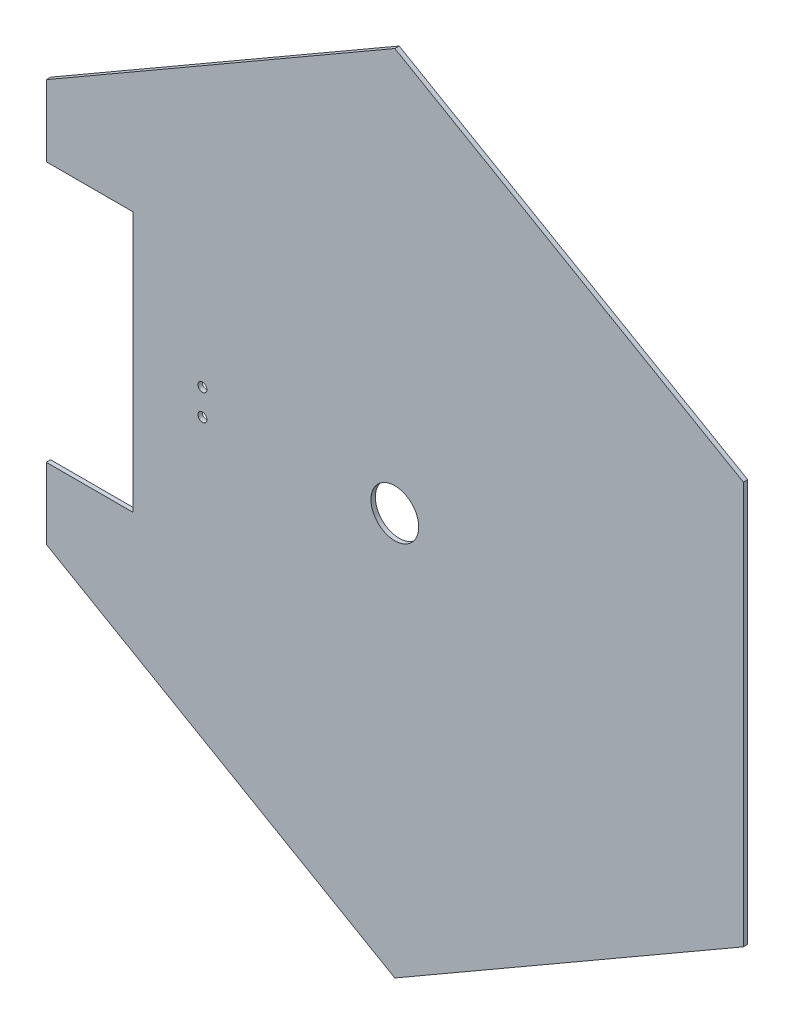
ISO-10303-21;
HEADER;
FILE_DESCRIPTION(('STEP AP214'),'2;1');
FILE_NAME('part.step','',(''),(''),'','','');
FILE_SCHEMA(('AUTOMOTIVE_DESIGN { 1 0 10303 214 1 1 1 1 }'));
ENDSEC;
DATA;
#1=APPLICATION_CONTEXT('core data for automotive mechanical design processes');
#2=APPLICATION_PROTOCOL_DEFINITION('international standard','automotive_design',2000,#1);
#3=PRODUCT_CONTEXT('',#1,'mechanical');
#4=PRODUCT('Part','Part','',(#3));
#5=PRODUCT_RELATED_PRODUCT_CATEGORY('part','',(#4));
#6=PRODUCT_DEFINITION_FORMATION('','',#4);
#7=PRODUCT_DEFINITION_CONTEXT('part definition',#1,'design');
#8=PRODUCT_DEFINITION('design','',#6,#7);
#9=PRODUCT_DEFINITION_SHAPE('','',#8);
#10=(LENGTH_UNIT() NAMED_UNIT(*) SI_UNIT(.MILLI.,.METRE.));
#11=(NAMED_UNIT(*) PLANE_ANGLE_UNIT() SI_UNIT($,.RADIAN.));
#12=(NAMED_UNIT(*) SI_UNIT($,.STERADIAN.) SOLID_ANGLE_UNIT());
#13=UNCERTAINTY_MEASURE_WITH_UNIT(LENGTH_MEASURE(1.E-05),#10,'distance_accuracy_value','');
#14=(GEOMETRIC_REPRESENTATION_CONTEXT(3) GLOBAL_UNCERTAINTY_ASSIGNED_CONTEXT((#13)) GLOBAL_UNIT_ASSIGNED_CONTEXT((#10,
#11,#12)) REPRESENTATION_CONTEXT('',''));
#15=CARTESIAN_POINT('',(0.,0.,0.));
#16=DIRECTION('',(0.,0.,1.));
#17=DIRECTION('',(1.,0.,0.));
#18=AXIS2_PLACEMENT_3D('',#15,#16,#17);
#19=CARTESIAN_POINT('',(0.,0.,1831.975));
#20=DIRECTION('',(0.,0.,-1.));
#21=DIRECTION('',(-1.,0.,0.));
#22=AXIS2_PLACEMENT_3D('',#19,#20,#21);
#23=PLANE('',#22);
#24=CARTESIAN_POINT('',(0.,0.,1831.97499999977));
#25=DIRECTION('',(0.,0.,-1.));
#26=DIRECTION('',(-1.,0.,0.));
#27=AXIS2_PLACEMENT_3D('',#24,#25,#26);
#28=CIRCLE('',#27,17.4625);
#29=CARTESIAN_POINT('',(-17.4625,0.,1831.97499999977));
#30=VERTEX_POINT('',#29);
#31=EDGE_CURVE('E124',#30,#30,#28,.T.);
#32=ORIENTED_EDGE('',*,*,#31,.T.);
#33=EDGE_LOOP('',(#32));
#34=FACE_BOUND('',#33,.T.);
#35=CARTESIAN_POINT('',(-140.865724971035,-9.525,1831.975));
#36=DIRECTION('',(0.,0.,-1.));
#37=DIRECTION('',(-1.,0.,0.));
#38=AXIS2_PLACEMENT_3D('',#35,#36,#37);
#39=CIRCLE('',#38,3.2639);
#40=CARTESIAN_POINT('',(-144.129624971035,-9.525,1831.975));
#41=VERTEX_POINT('',#40);
#42=EDGE_CURVE('E127',#41,#41,#39,.T.);
#43=ORIENTED_EDGE('',*,*,#42,.T.);
#44=EDGE_LOOP('',(#43));
#45=FACE_BOUND('',#44,.T.);
#46=CARTESIAN_POINT('',(-140.865724971035,9.525,1831.975));
#47=DIRECTION('',(0.,0.,-1.));
#48=DIRECTION('',(-1.,0.,0.));
#49=AXIS2_PLACEMENT_3D('',#46,#47,#48);
#50=CIRCLE('',#49,3.2639);
#51=CARTESIAN_POINT('',(-144.129624971035,9.525,1831.975));
#52=VERTEX_POINT('',#51);
#53=EDGE_CURVE('E20',#52,#52,#50,.T.);
#54=ORIENTED_EDGE('',*,*,#53,.T.);
#55=EDGE_LOOP('',(#54));
#56=FACE_BOUND('',#55,.T.);
#57=DIRECTION('',(-0.866025403784429,0.500000000000017,0.));
#58=VECTOR('',#57,1.);
#59=CARTESIAN_POINT('',(-123.398182996562,-223.396025829432,1831.975));
#60=LINE('',#59,#58);
#61=CARTESIAN_POINT('',(-255.16572497106,-147.319999999999,1831.975));
#62=VERTEX_POINT('',#61);
#63=CARTESIAN_POINT('',(-1.62444224738319E-12,-294.640000000004,1831.975));
#64=VERTEX_POINT('',#63);
#65=EDGE_CURVE('E143',#62,#64,#60,.F.);
#66=ORIENTED_EDGE('',*,*,#65,.T.);
#67=DIRECTION('',(-0.866025403784429,-0.500000000000017,0.));
#68=VECTOR('',#67,1.);
#69=CARTESIAN_POINT('',(131.767541974473,-218.563974170593,1831.975));
#70=LINE('',#69,#68);
#71=CARTESIAN_POINT('',(255.16572497106,-147.32,1831.975));
#72=VERTEX_POINT('',#71);
#73=EDGE_CURVE('E147',#64,#72,#70,.F.);
#74=ORIENTED_EDGE('',*,*,#73,.T.);
#75=DIRECTION('',(0.,1.,0.));
#76=VECTOR('',#75,1.);
#77=CARTESIAN_POINT('',(255.16572497106,4.83205165884408,1831.975));
#78=LINE('',#77,#76);
#79=CARTESIAN_POINT('',(255.165724971058,147.319999999997,1831.975));
#80=VERTEX_POINT('',#79);
#81=EDGE_CURVE('E151',#72,#80,#78,.T.);
#82=ORIENTED_EDGE('',*,*,#81,.T.);
#83=DIRECTION('',(0.866025403784429,-0.500000000000017,0.));
#84=VECTOR('',#83,1.);
#85=CARTESIAN_POINT('',(123.398182996587,223.396025829407,1831.975));
#86=LINE('',#85,#84);
#87=CARTESIAN_POINT('',(-8.84859697202219E-13,294.640000000002,1831.975));
#88=VERTEX_POINT('',#87);
#89=EDGE_CURVE('E155',#80,#88,#86,.F.);
#90=ORIENTED_EDGE('',*,*,#89,.T.);
#91=DIRECTION('',(0.866025403784429,0.500000000000017,0.));
#92=VECTOR('',#91,1.);
#93=CARTESIAN_POINT('',(-131.767541974473,218.563974170593,1831.975));
#94=LINE('',#93,#92);
#95=CARTESIAN_POINT('',(-255.16572497106,147.32,1831.975));
#96=VERTEX_POINT('',#95);
#97=EDGE_CURVE('E159',#88,#96,#94,.F.);
#98=ORIENTED_EDGE('',*,*,#97,.T.);
#99=DIRECTION('',(0.,1.,0.));
#100=VECTOR('',#99,1.);
#101=CARTESIAN_POINT('',(-255.16572497106,-4.832051658839,1831.975));
#102=LINE('',#101,#100);
#103=CARTESIAN_POINT('',(-255.16572497106,95.25,1831.975));
#104=VERTEX_POINT('',#103);
#105=EDGE_CURVE('E163',#96,#104,#102,.F.);
#106=ORIENTED_EDGE('',*,*,#105,.T.);
#107=DIRECTION('',(1.,0.,0.));
#108=VECTOR('',#107,1.);
#109=CARTESIAN_POINT('',(-224.260467708114,95.25,1831.975));
#110=LINE('',#109,#108);
#111=CARTESIAN_POINT('',(-191.665724971035,95.25,1831.975));
#112=VERTEX_POINT('',#111);
#113=EDGE_CURVE('E107',#112,#104,#110,.F.);
#114=ORIENTED_EDGE('',*,*,#113,.F.);
#115=DIRECTION('',(0.,1.,0.));
#116=VECTOR('',#115,1.);
#117=CARTESIAN_POINT('',(-191.665724971035,-33.7703803986266,1831.975));
#118=LINE('',#117,#116);
#119=CARTESIAN_POINT('',(-191.665724971035,-95.25,1831.975));
#120=VERTEX_POINT('',#119);
#121=EDGE_CURVE('E92',#120,#112,#118,.T.);
#122=ORIENTED_EDGE('',*,*,#121,.F.);
#123=DIRECTION('',(1.,0.,0.));
#124=VECTOR('',#123,1.);
#125=CARTESIAN_POINT('',(-224.260467708114,-95.25,1831.975));
#126=LINE('',#125,#124);
#127=CARTESIAN_POINT('',(-255.16572497106,-95.25,1831.975));
#128=VERTEX_POINT('',#127);
#129=EDGE_CURVE('E97',#120,#128,#126,.F.);
#130=ORIENTED_EDGE('',*,*,#129,.T.);
#131=DIRECTION('',(0.,1.,0.));
#132=VECTOR('',#131,1.);
#133=CARTESIAN_POINT('',(-255.16572497106,-4.832051658839,1831.975));
#134=LINE('',#133,#132);
#135=EDGE_CURVE('E134',#128,#62,#134,.F.);
#136=ORIENTED_EDGE('',*,*,#135,.T.);
#137=EDGE_LOOP('',(#66,#74,#82,#90,#98,#106,#114,#122,#130,#136));
#138=FACE_BOUND('',#137,.T.);
#139=ADVANCED_FACE('F17',(#34,#45,#56,#138),#23,.F.);
#140=CARTESIAN_POINT('',(-224.260467708114,-95.25,-500000.000000032));
#141=DIRECTION('',(0.,-1.,0.));
#142=DIRECTION('',(0.,0.,-1.));
#143=AXIS2_PLACEMENT_3D('',#140,#141,#142);
#144=PLANE('',#143);
#145=DIRECTION('',(0.,0.,1.));
#146=VECTOR('',#145,1.);
#147=CARTESIAN_POINT('',(-191.665724971035,-95.25,-500000.000000032));
#148=LINE('',#147,#146);
#149=CARTESIAN_POINT('',(-191.665724971035,-95.25,1828.8));
#150=VERTEX_POINT('',#149);
#151=EDGE_CURVE('E99',#150,#120,#148,.T.);
#152=ORIENTED_EDGE('',*,*,#151,.F.);
#153=DIRECTION('',(-1.,0.,0.));
#154=VECTOR('',#153,1.);
#155=CARTESIAN_POINT('',(0.,-95.25,1828.8));
#156=LINE('',#155,#154);
#157=CARTESIAN_POINT('',(-255.16572497106,-95.25,1828.8));
#158=VERTEX_POINT('',#157);
#159=EDGE_CURVE('E126',#158,#150,#156,.F.);
#160=ORIENTED_EDGE('',*,*,#159,.F.);
#161=DIRECTION('',(0.,0.,-1.));
#162=VECTOR('',#161,1.);
#163=CARTESIAN_POINT('',(-255.16572497106,-95.25,1831.975));
#164=LINE('',#163,#162);
#165=EDGE_CURVE('E102',#158,#128,#164,.F.);
#166=ORIENTED_EDGE('',*,*,#165,.T.);
#167=ORIENTED_EDGE('',*,*,#129,.F.);
#168=EDGE_LOOP('',(#152,#160,#166,#167));
#169=FACE_BOUND('',#168,.T.);
#170=ADVANCED_FACE('F98',(#169),#144,.F.);
#171=CARTESIAN_POINT('',(-191.665724971035,-33.7703803986266,-500000.000000032));
#172=DIRECTION('',(-1.,0.,0.));
#173=DIRECTION('',(0.,0.,1.));
#174=AXIS2_PLACEMENT_3D('',#171,#172,#173);
#175=PLANE('',#174);
#176=DIRECTION('',(0.,0.,-1.));
#177=VECTOR('',#176,1.);
#178=CARTESIAN_POINT('',(-191.665724971035,95.25,-500000.000000032));
#179=LINE('',#178,#177);
#180=CARTESIAN_POINT('',(-191.665724971035,95.25,1828.8));
#181=VERTEX_POINT('',#180);
#182=EDGE_CURVE('E109',#181,#112,#179,.F.);
#183=ORIENTED_EDGE('',*,*,#182,.F.);
#184=DIRECTION('',(0.,1.,0.));
#185=VECTOR('',#184,1.);
#186=CARTESIAN_POINT('',(-191.665724971035,0.,1828.8));
#187=LINE('',#186,#185);
#188=EDGE_CURVE('E113',#150,#181,#187,.T.);
#189=ORIENTED_EDGE('',*,*,#188,.F.);
#190=ORIENTED_EDGE('',*,*,#151,.T.);
#191=ORIENTED_EDGE('',*,*,#121,.T.);
#192=EDGE_LOOP('',(#183,#189,#190,#191));
#193=FACE_BOUND('',#192,.T.);
#194=ADVANCED_FACE('F111',(#193),#175,.T.);
#195=CARTESIAN_POINT('',(-224.260467708114,95.25,-500000.000000032));
#196=DIRECTION('',(0.,-1.,0.));
#197=DIRECTION('',(0.,0.,-1.));
#198=AXIS2_PLACEMENT_3D('',#195,#196,#197);
#199=PLANE('',#198);
#200=DIRECTION('',(0.,0.,-1.));
#201=VECTOR('',#200,1.);
#202=CARTESIAN_POINT('',(-255.16572497106,95.25,1831.975));
#203=LINE('',#202,#201);
#204=CARTESIAN_POINT('',(-255.16572497106,95.25,1828.8));
#205=VERTEX_POINT('',#204);
#206=EDGE_CURVE('E161',#104,#205,#203,.T.);
#207=ORIENTED_EDGE('',*,*,#206,.T.);
#208=DIRECTION('',(-1.,0.,0.));
#209=VECTOR('',#208,1.);
#210=CARTESIAN_POINT('',(0.,95.25,1828.8));
#211=LINE('',#210,#209);
#212=EDGE_CURVE('E170',#181,#205,#211,.T.);
#213=ORIENTED_EDGE('',*,*,#212,.F.);
#214=ORIENTED_EDGE('',*,*,#182,.T.);
#215=ORIENTED_EDGE('',*,*,#113,.T.);
#216=EDGE_LOOP('',(#207,#213,#214,#215));
#217=FACE_BOUND('',#216,.T.);
#218=ADVANCED_FACE('F167',(#217),#199,.T.);
#219=CARTESIAN_POINT('',(-255.16572497106,-4.832051658839,1831.975));
#220=DIRECTION('',(1.,0.,0.));
#221=DIRECTION('',(0.,0.,-1.));
#222=AXIS2_PLACEMENT_3D('',#219,#220,#221);
#223=PLANE('',#222);
#224=ORIENTED_EDGE('',*,*,#105,.F.);
#225=DIRECTION('',(0.,0.,1.));
#226=VECTOR('',#225,1.);
#227=CARTESIAN_POINT('',(-255.16572497106,147.32,1831.975));
#228=LINE('',#227,#226);
#229=CARTESIAN_POINT('',(-255.16572497106,147.32,1828.8));
#230=VERTEX_POINT('',#229);
#231=EDGE_CURVE('E157',#96,#230,#228,.F.);
#232=ORIENTED_EDGE('',*,*,#231,.T.);
#233=DIRECTION('',(0.,1.,0.));
#234=VECTOR('',#233,1.);
#235=CARTESIAN_POINT('',(-255.16572497106,0.,1828.8));
#236=LINE('',#235,#234);
#237=EDGE_CURVE('E174',#205,#230,#236,.T.);
#238=ORIENTED_EDGE('',*,*,#237,.F.);
#239=ORIENTED_EDGE('',*,*,#206,.F.);
#240=EDGE_LOOP('',(#224,#232,#238,#239));
#241=FACE_BOUND('',#240,.T.);
#242=ADVANCED_FACE('F221',(#241),#223,.F.);
#243=CARTESIAN_POINT('',(-131.767541974473,218.563974170593,1831.975));
#244=DIRECTION('',(0.500000000000017,-0.866025403784429,0.));
#245=DIRECTION('',(0.866025403784429,0.500000000000017,0.));
#246=AXIS2_PLACEMENT_3D('',#243,#244,#245);
#247=PLANE('',#246);
#248=ORIENTED_EDGE('',*,*,#97,.F.);
#249=DIRECTION('',(0.,0.,1.));
#250=VECTOR('',#249,1.);
#251=CARTESIAN_POINT('',(1.9151347174784E-12,294.639999999999,1831.975));
#252=LINE('',#251,#250);
#253=CARTESIAN_POINT('',(-6.10373286508897E-12,294.640000000004,1828.8));
#254=VERTEX_POINT('',#253);
#255=EDGE_CURVE('E153',#88,#254,#252,.F.);
#256=ORIENTED_EDGE('',*,*,#255,.T.);
#257=DIRECTION('',(0.866025403784445,0.499999999999989,0.));
#258=VECTOR('',#257,1.);
#259=CARTESIAN_POINT('',(-255.16572497106,147.32,1828.8));
#260=LINE('',#259,#258);
#261=EDGE_CURVE('E181',#230,#254,#260,.T.);
#262=ORIENTED_EDGE('',*,*,#261,.F.);
#263=ORIENTED_EDGE('',*,*,#231,.F.);
#264=EDGE_LOOP('',(#248,#256,#262,#263));
#265=FACE_BOUND('',#264,.T.);
#266=ADVANCED_FACE('F218',(#265),#247,.F.);
#267=CARTESIAN_POINT('',(123.398182996587,223.396025829407,1831.975));
#268=DIRECTION('',(-0.500000000000017,-0.866025403784429,0.));
#269=DIRECTION('',(0.866025403784429,-0.500000000000017,0.));
#270=AXIS2_PLACEMENT_3D('',#267,#268,#269);
#271=PLANE('',#270);
#272=ORIENTED_EDGE('',*,*,#89,.F.);
#273=DIRECTION('',(0.,0.,1.));
#274=VECTOR('',#273,1.);
#275=CARTESIAN_POINT('',(255.16572497106,147.32,1831.975));
#276=LINE('',#275,#274);
#277=CARTESIAN_POINT('',(255.165724971057,147.319999999995,1828.8));
#278=VERTEX_POINT('',#277);
#279=EDGE_CURVE('E149',#80,#278,#276,.F.);
#280=ORIENTED_EDGE('',*,*,#279,.T.);
#281=DIRECTION('',(0.866025403784455,-0.499999999999972,0.));
#282=VECTOR('',#281,1.);
#283=CARTESIAN_POINT('',(-5.76374439624482E-12,294.64,1828.8));
#284=LINE('',#283,#282);
#285=EDGE_CURVE('E184',#254,#278,#284,.T.);
#286=ORIENTED_EDGE('',*,*,#285,.F.);
#287=ORIENTED_EDGE('',*,*,#255,.F.);
#288=EDGE_LOOP('',(#272,#280,#286,#287));
#289=FACE_BOUND('',#288,.T.);
#290=ADVANCED_FACE('F212',(#289),#271,.F.);
#291=CARTESIAN_POINT('',(255.16572497106,4.83205165884408,1831.975));
#292=DIRECTION('',(-1.,0.,0.));
#293=DIRECTION('',(0.,0.,1.));
#294=AXIS2_PLACEMENT_3D('',#291,#292,#293);
#295=PLANE('',#294);
#296=ORIENTED_EDGE('',*,*,#81,.F.);
#297=DIRECTION('',(0.,0.,1.));
#298=VECTOR('',#297,1.);
#299=CARTESIAN_POINT('',(255.16572497106,-147.32,1831.975));
#300=LINE('',#299,#298);
#301=CARTESIAN_POINT('',(255.16572497106,-147.32,1828.8));
#302=VERTEX_POINT('',#301);
#303=EDGE_CURVE('E145',#72,#302,#300,.F.);
#304=ORIENTED_EDGE('',*,*,#303,.T.);
#305=DIRECTION('',(0.,1.,0.));
#306=VECTOR('',#305,1.);
#307=CARTESIAN_POINT('',(255.16572497106,0.,1828.8));
#308=LINE('',#307,#306);
#309=EDGE_CURVE('E187',#278,#302,#308,.F.);
#310=ORIENTED_EDGE('',*,*,#309,.F.);
#311=ORIENTED_EDGE('',*,*,#279,.F.);
#312=EDGE_LOOP('',(#296,#304,#310,#311));
#313=FACE_BOUND('',#312,.T.);
#314=ADVANCED_FACE('F208',(#313),#295,.F.);
#315=CARTESIAN_POINT('',(131.767541974473,-218.563974170593,1831.975));
#316=DIRECTION('',(-0.500000000000017,0.866025403784429,0.));
#317=DIRECTION('',(-0.866025403784429,-0.500000000000017,0.));
#318=AXIS2_PLACEMENT_3D('',#315,#316,#317);
#319=PLANE('',#318);
#320=ORIENTED_EDGE('',*,*,#73,.F.);
#321=DIRECTION('',(0.,0.,1.));
#322=VECTOR('',#321,1.);
#323=CARTESIAN_POINT('',(-7.71605002114484E-12,-294.640000000007,1831.975));
#324=LINE('',#323,#322);
#325=CARTESIAN_POINT('',(3.67169905590712E-12,-294.640000000006,1828.8));
#326=VERTEX_POINT('',#325);
#327=EDGE_CURVE('E141',#64,#326,#324,.F.);
#328=ORIENTED_EDGE('',*,*,#327,.T.);
#329=DIRECTION('',(-0.866025403784446,-0.499999999999987,0.));
#330=VECTOR('',#329,1.);
#331=CARTESIAN_POINT('',(255.16572497106,-147.32,1828.8));
#332=LINE('',#331,#330);
#333=EDGE_CURVE('E190',#302,#326,#332,.T.);
#334=ORIENTED_EDGE('',*,*,#333,.F.);
#335=ORIENTED_EDGE('',*,*,#303,.F.);
#336=EDGE_LOOP('',(#320,#328,#334,#335));
#337=FACE_BOUND('',#336,.T.);
#338=ADVANCED_FACE('F202',(#337),#319,.F.);
#339=CARTESIAN_POINT('',(-123.398182996562,-223.396025829432,1831.975));
#340=DIRECTION('',(0.500000000000017,0.866025403784429,0.));
#341=DIRECTION('',(-0.866025403784429,0.500000000000017,0.));
#342=AXIS2_PLACEMENT_3D('',#339,#340,#341);
#343=PLANE('',#342);
#344=ORIENTED_EDGE('',*,*,#65,.F.);
#345=DIRECTION('',(0.,0.,-1.));
#346=VECTOR('',#345,1.);
#347=CARTESIAN_POINT('',(-255.16572497106,-147.32,1831.975));
#348=LINE('',#347,#346);
#349=CARTESIAN_POINT('',(-255.165724971059,-147.319999999999,1828.8));
#350=VERTEX_POINT('',#349);
#351=EDGE_CURVE('E35',#62,#350,#348,.T.);
#352=ORIENTED_EDGE('',*,*,#351,.T.);
#353=DIRECTION('',(-0.866025403784453,0.499999999999975,0.));
#354=VECTOR('',#353,1.);
#355=CARTESIAN_POINT('',(4.19611012603068E-12,-294.64,1828.8));
#356=LINE('',#355,#354);
#357=EDGE_CURVE('E193',#326,#350,#356,.T.);
#358=ORIENTED_EDGE('',*,*,#357,.F.);
#359=ORIENTED_EDGE('',*,*,#327,.F.);
#360=EDGE_LOOP('',(#344,#352,#358,#359));
#361=FACE_BOUND('',#360,.T.);
#362=ADVANCED_FACE('F199',(#361),#343,.F.);
#363=CARTESIAN_POINT('',(-255.16572497106,-4.832051658839,1831.975));
#364=DIRECTION('',(1.,0.,0.));
#365=DIRECTION('',(0.,0.,-1.));
#366=AXIS2_PLACEMENT_3D('',#363,#364,#365);
#367=PLANE('',#366);
#368=ORIENTED_EDGE('',*,*,#351,.F.);
#369=ORIENTED_EDGE('',*,*,#135,.F.);
#370=ORIENTED_EDGE('',*,*,#165,.F.);
#371=DIRECTION('',(0.,1.,0.));
#372=VECTOR('',#371,1.);
#373=CARTESIAN_POINT('',(-255.16572497106,0.,1828.8));
#374=LINE('',#373,#372);
#375=EDGE_CURVE('E123',#350,#158,#374,.T.);
#376=ORIENTED_EDGE('',*,*,#375,.F.);
#377=EDGE_LOOP('',(#368,#369,#370,#376));
#378=FACE_BOUND('',#377,.T.);
#379=ADVANCED_FACE('F196',(#378),#367,.F.);
#380=CARTESIAN_POINT('',(-140.865724971035,9.525,1827.81942551284));
#381=DIRECTION('',(0.,0.,-1.));
#382=DIRECTION('',(-1.,0.,0.));
#383=AXIS2_PLACEMENT_3D('',#380,#381,#382);
#384=CYLINDRICAL_SURFACE('',#383,3.2639);
#385=CARTESIAN_POINT('',(-140.865724971035,9.525,1828.8));
#386=DIRECTION('',(0.,0.,-1.));
#387=DIRECTION('',(-1.,0.,0.));
#388=AXIS2_PLACEMENT_3D('',#385,#386,#387);
#389=CIRCLE('',#388,3.2639);
#390=CARTESIAN_POINT('',(-144.129624971035,9.525,1828.8));
#391=VERTEX_POINT('',#390);
#392=EDGE_CURVE('E120',#391,#391,#389,.F.);
#393=ORIENTED_EDGE('',*,*,#392,.F.);
#394=EDGE_LOOP('',(#393));
#395=FACE_BOUND('',#394,.T.);
#396=ORIENTED_EDGE('',*,*,#53,.F.);
#397=EDGE_LOOP('',(#396));
#398=FACE_BOUND('',#397,.T.);
#399=ADVANCED_FACE('F245',(#395,#398),#384,.F.);
#400=CARTESIAN_POINT('',(-140.865724971035,-9.525,1827.81942551284));
#401=DIRECTION('',(0.,0.,-1.));
#402=DIRECTION('',(-1.,0.,0.));
#403=AXIS2_PLACEMENT_3D('',#400,#401,#402);
#404=CYLINDRICAL_SURFACE('',#403,3.2639);
#405=CARTESIAN_POINT('',(-140.865724971035,-9.525,1828.8));
#406=DIRECTION('',(0.,0.,-1.));
#407=DIRECTION('',(-1.,0.,0.));
#408=AXIS2_PLACEMENT_3D('',#405,#406,#407);
#409=CIRCLE('',#408,3.2639);
#410=CARTESIAN_POINT('',(-144.129624971035,-9.525,1828.8));
#411=VERTEX_POINT('',#410);
#412=EDGE_CURVE('E26',#411,#411,#409,.F.);
#413=ORIENTED_EDGE('',*,*,#412,.F.);
#414=EDGE_LOOP('',(#413));
#415=FACE_BOUND('',#414,.T.);
#416=ORIENTED_EDGE('',*,*,#42,.F.);
#417=EDGE_LOOP('',(#416));
#418=FACE_BOUND('',#417,.T.);
#419=ADVANCED_FACE('F238',(#415,#418),#404,.F.);
#420=CARTESIAN_POINT('',(0.,0.,-500000.000000032));
#421=DIRECTION('',(0.,0.,-1.));
#422=DIRECTION('',(-1.,0.,0.));
#423=AXIS2_PLACEMENT_3D('',#420,#421,#422);
#424=CYLINDRICAL_SURFACE('',#423,17.4625);
#425=ORIENTED_EDGE('',*,*,#31,.F.);
#426=EDGE_LOOP('',(#425));
#427=FACE_BOUND('',#426,.T.);
#428=CARTESIAN_POINT('',(0.,0.,1828.79999999977));
#429=DIRECTION('',(0.,0.,-1.));
#430=DIRECTION('',(-1.,0.,0.));
#431=AXIS2_PLACEMENT_3D('',#428,#429,#430);
#432=CIRCLE('',#431,17.4625);
#433=CARTESIAN_POINT('',(-17.4625,0.,1828.79999999977));
#434=VERTEX_POINT('',#433);
#435=EDGE_CURVE('E11',#434,#434,#432,.F.);
#436=ORIENTED_EDGE('',*,*,#435,.F.);
#437=EDGE_LOOP('',(#436));
#438=FACE_BOUND('',#437,.T.);
#439=ADVANCED_FACE('F232',(#427,#438),#424,.F.);
#440=CARTESIAN_POINT('',(0.,0.,1828.8));
#441=DIRECTION('',(0.,0.,-1.));
#442=DIRECTION('',(-1.,0.,0.));
#443=AXIS2_PLACEMENT_3D('',#440,#441,#442);
#444=PLANE('',#443);
#445=ORIENTED_EDGE('',*,*,#435,.T.);
#446=EDGE_LOOP('',(#445));
#447=FACE_BOUND('',#446,.T.);
#448=ORIENTED_EDGE('',*,*,#412,.T.);
#449=EDGE_LOOP('',(#448));
#450=FACE_BOUND('',#449,.T.);
#451=ORIENTED_EDGE('',*,*,#392,.T.);
#452=EDGE_LOOP('',(#451));
#453=FACE_BOUND('',#452,.T.);
#454=ORIENTED_EDGE('',*,*,#357,.T.);
#455=ORIENTED_EDGE('',*,*,#375,.T.);
#456=ORIENTED_EDGE('',*,*,#159,.T.);
#457=ORIENTED_EDGE('',*,*,#188,.T.);
#458=ORIENTED_EDGE('',*,*,#212,.T.);
#459=ORIENTED_EDGE('',*,*,#237,.T.);
#460=ORIENTED_EDGE('',*,*,#261,.T.);
#461=ORIENTED_EDGE('',*,*,#285,.T.);
#462=ORIENTED_EDGE('',*,*,#309,.T.);
#463=ORIENTED_EDGE('',*,*,#333,.T.);
#464=EDGE_LOOP('',(#454,#455,#456,#457,#458,#459,#460,#461,#462,#463));
#465=FACE_BOUND('',#464,.T.);
#466=ADVANCED_FACE('F177',(#447,#450,#453,#465),#444,.T.);
#467=CLOSED_SHELL('',(#139,#170,#194,#218,#242,#266,#290,#314,#338,#362,#379,#399,#419,#439,#466));
#468=MANIFOLD_SOLID_BREP('B1',#467);
#469=ADVANCED_BREP_SHAPE_REPRESENTATION('',(#18,#468),#14);
#470=SHAPE_DEFINITION_REPRESENTATION(#9,#469);
ENDSEC;
END-ISO-10303-21;
